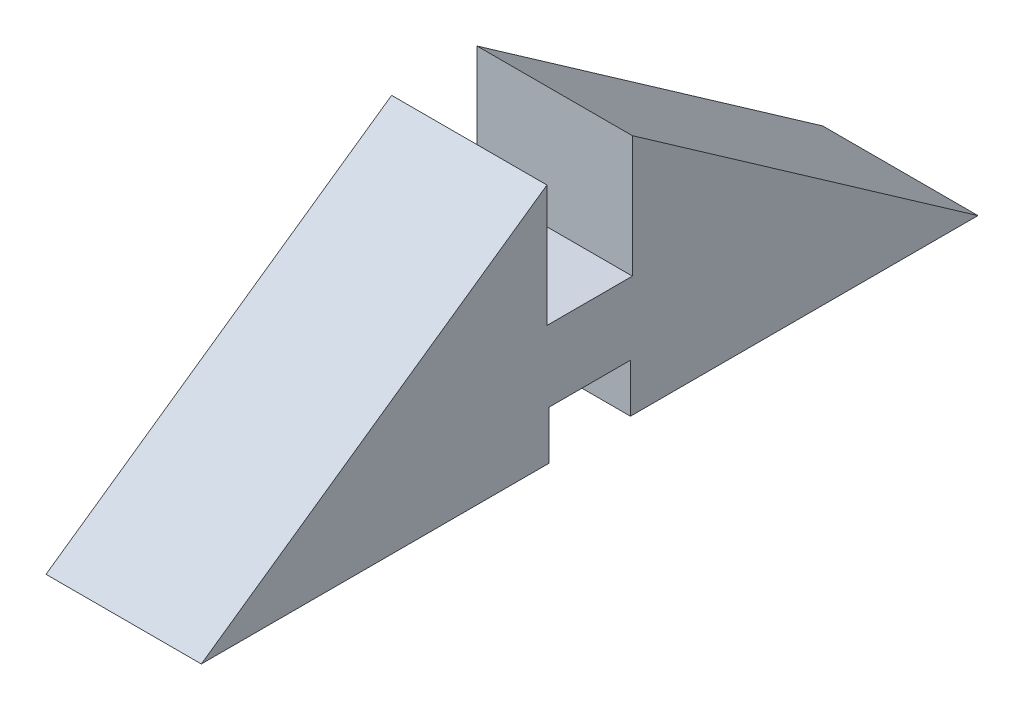
ISO-10303-21;
HEADER;
FILE_DESCRIPTION(('STEP AP214'),'2;1');
FILE_NAME('part.step','',(''),(''),'','','');
FILE_SCHEMA(('AUTOMOTIVE_DESIGN { 1 0 10303 214 1 1 1 1 }'));
ENDSEC;
DATA;
#1=APPLICATION_CONTEXT('core data for automotive mechanical design processes');
#2=APPLICATION_PROTOCOL_DEFINITION('international standard','automotive_design',2000,#1);
#3=PRODUCT_CONTEXT('',#1,'mechanical');
#4=PRODUCT('Part','Part','',(#3));
#5=PRODUCT_RELATED_PRODUCT_CATEGORY('part','',(#4));
#6=PRODUCT_DEFINITION_FORMATION('','',#4);
#7=PRODUCT_DEFINITION_CONTEXT('part definition',#1,'design');
#8=PRODUCT_DEFINITION('design','',#6,#7);
#9=PRODUCT_DEFINITION_SHAPE('','',#8);
#10=(LENGTH_UNIT() NAMED_UNIT(*) SI_UNIT(.MILLI.,.METRE.));
#11=(NAMED_UNIT(*) PLANE_ANGLE_UNIT() SI_UNIT($,.RADIAN.));
#12=(NAMED_UNIT(*) SI_UNIT($,.STERADIAN.) SOLID_ANGLE_UNIT());
#13=UNCERTAINTY_MEASURE_WITH_UNIT(LENGTH_MEASURE(1.E-05),#10,'distance_accuracy_value','');
#14=(GEOMETRIC_REPRESENTATION_CONTEXT(3) GLOBAL_UNCERTAINTY_ASSIGNED_CONTEXT((#13)) GLOBAL_UNIT_ASSIGNED_CONTEXT((#10,
#11,#12)) REPRESENTATION_CONTEXT('',''));
#15=CARTESIAN_POINT('',(0.,0.,0.));
#16=DIRECTION('',(0.,0.,1.));
#17=DIRECTION('',(1.,0.,0.));
#18=AXIS2_PLACEMENT_3D('',#15,#16,#17);
#19=CARTESIAN_POINT('',(-83.9,-55.75,5.25));
#20=DIRECTION('',(0.,-1.,0.));
#21=DIRECTION('',(1.,0.,0.));
#22=AXIS2_PLACEMENT_3D('',#19,#20,#21);
#23=PLANE('',#22);
#24=DIRECTION('',(0.,0.,-1.));
#25=VECTOR('',#24,1.);
#26=CARTESIAN_POINT('',(-73.9,-55.75,5.25));
#27=LINE('',#26,#25);
#28=CARTESIAN_POINT('',(-73.9,-55.75,5.25));
#29=VERTEX_POINT('',#28);
#30=CARTESIAN_POINT('',(-73.9,-55.75,-0.25));
#31=VERTEX_POINT('',#30);
#32=EDGE_CURVE('E141',#29,#31,#27,.T.);
#33=ORIENTED_EDGE('',*,*,#32,.T.);
#34=DIRECTION('',(1.,0.,0.));
#35=VECTOR('',#34,1.);
#36=CARTESIAN_POINT('',(-83.9,-55.75,-0.25));
#37=LINE('',#36,#35);
#38=CARTESIAN_POINT('',(-83.9,-55.75,-0.25));
#39=VERTEX_POINT('',#38);
#40=EDGE_CURVE('E11',#39,#31,#37,.T.);
#41=ORIENTED_EDGE('',*,*,#40,.F.);
#42=DIRECTION('',(0.,0.,-1.));
#43=VECTOR('',#42,1.);
#44=CARTESIAN_POINT('',(-83.9,-55.75,5.25));
#45=LINE('',#44,#43);
#46=CARTESIAN_POINT('',(-83.9,-55.75,5.25));
#47=VERTEX_POINT('',#46);
#48=EDGE_CURVE('E159',#47,#39,#45,.T.);
#49=ORIENTED_EDGE('',*,*,#48,.F.);
#50=DIRECTION('',(1.,0.,0.));
#51=VECTOR('',#50,1.);
#52=CARTESIAN_POINT('',(-83.9,-55.75,5.25));
#53=LINE('',#52,#51);
#54=EDGE_CURVE('E137',#47,#29,#53,.T.);
#55=ORIENTED_EDGE('',*,*,#54,.T.);
#56=EDGE_LOOP('',(#33,#41,#49,#55));
#57=FACE_BOUND('',#56,.T.);
#58=ADVANCED_FACE('F33',(#57),#23,.F.);
#59=CARTESIAN_POINT('',(-83.9,-55.75,-0.25));
#60=DIRECTION('',(0.,0.,-1.));
#61=DIRECTION('',(0.,1.,0.));
#62=AXIS2_PLACEMENT_3D('',#59,#60,#61);
#63=PLANE('',#62);
#64=DIRECTION('',(0.,1.,0.));
#65=VECTOR('',#64,1.);
#66=CARTESIAN_POINT('',(-73.9,-55.75,-0.25));
#67=LINE('',#66,#65);
#68=CARTESIAN_POINT('',(-73.9,-47.9203822748341,-0.25));
#69=VERTEX_POINT('',#68);
#70=EDGE_CURVE('E144',#31,#69,#67,.T.);
#71=ORIENTED_EDGE('',*,*,#70,.T.);
#72=DIRECTION('',(1.,0.,0.));
#73=VECTOR('',#72,1.);
#74=CARTESIAN_POINT('',(-83.9,-47.9203822748341,-0.25));
#75=LINE('',#74,#73);
#76=CARTESIAN_POINT('',(-83.9,-47.9203822748341,-0.25));
#77=VERTEX_POINT('',#76);
#78=EDGE_CURVE('E41',#77,#69,#75,.T.);
#79=ORIENTED_EDGE('',*,*,#78,.F.);
#80=DIRECTION('',(0.,1.,0.));
#81=VECTOR('',#80,1.);
#82=CARTESIAN_POINT('',(-83.9,-55.75,-0.25));
#83=LINE('',#82,#81);
#84=EDGE_CURVE('E98',#39,#77,#83,.T.);
#85=ORIENTED_EDGE('',*,*,#84,.F.);
#86=ORIENTED_EDGE('',*,*,#40,.T.);
#87=EDGE_LOOP('',(#71,#79,#85,#86));
#88=FACE_BOUND('',#87,.T.);
#89=ADVANCED_FACE('F208',(#88),#63,.F.);
#90=CARTESIAN_POINT('',(-83.9,-47.9203822748341,-0.25));
#91=DIRECTION('',(0.,-0.819152044288995,0.573576436351041));
#92=DIRECTION('',(0.,-0.573576436351041,-0.819152044288995));
#93=AXIS2_PLACEMENT_3D('',#90,#91,#92);
#94=PLANE('',#93);
#95=DIRECTION('',(0.,-0.573576436351042,-0.819152044288995));
#96=VECTOR('',#95,1.);
#97=CARTESIAN_POINT('',(-73.9,-47.9203822748341,-0.25));
#98=LINE('',#97,#96);
#99=CARTESIAN_POINT('',(-73.9,-63.5,-22.5));
#100=VERTEX_POINT('',#99);
#101=EDGE_CURVE('E146',#69,#100,#98,.T.);
#102=ORIENTED_EDGE('',*,*,#101,.T.);
#103=DIRECTION('',(1.,0.,0.));
#104=VECTOR('',#103,1.);
#105=CARTESIAN_POINT('',(-83.9,-63.5,-22.5));
#106=LINE('',#105,#104);
#107=CARTESIAN_POINT('',(-83.9,-63.5,-22.5));
#108=VERTEX_POINT('',#107);
#109=EDGE_CURVE('E172',#108,#100,#106,.T.);
#110=ORIENTED_EDGE('',*,*,#109,.F.);
#111=DIRECTION('',(0.,-0.573576436351042,-0.819152044288995));
#112=VECTOR('',#111,1.);
#113=CARTESIAN_POINT('',(-83.9,-47.9203822748341,-0.25));
#114=LINE('',#113,#112);
#115=EDGE_CURVE('E180',#77,#108,#114,.T.);
#116=ORIENTED_EDGE('',*,*,#115,.F.);
#117=ORIENTED_EDGE('',*,*,#78,.T.);
#118=EDGE_LOOP('',(#102,#110,#116,#117));
#119=FACE_BOUND('',#118,.T.);
#120=ADVANCED_FACE('F178',(#119),#94,.F.);
#121=CARTESIAN_POINT('',(-83.9,-63.5,-22.5));
#122=DIRECTION('',(0.,1.,0.));
#123=DIRECTION('',(-1.,0.,0.));
#124=AXIS2_PLACEMENT_3D('',#121,#122,#123);
#125=PLANE('',#124);
#126=DIRECTION('',(0.,0.,1.));
#127=VECTOR('',#126,1.);
#128=CARTESIAN_POINT('',(-73.9,-63.5,-22.5));
#129=LINE('',#128,#127);
#130=CARTESIAN_POINT('',(-73.9,-63.5,-0.125));
#131=VERTEX_POINT('',#130);
#132=EDGE_CURVE('E148',#100,#131,#129,.T.);
#133=ORIENTED_EDGE('',*,*,#132,.T.);
#134=DIRECTION('',(1.,0.,0.));
#135=VECTOR('',#134,1.);
#136=CARTESIAN_POINT('',(-83.9,-63.5,-0.125));
#137=LINE('',#136,#135);
#138=CARTESIAN_POINT('',(-83.9,-63.5,-0.125));
#139=VERTEX_POINT('',#138);
#140=EDGE_CURVE('E169',#139,#131,#137,.T.);
#141=ORIENTED_EDGE('',*,*,#140,.F.);
#142=DIRECTION('',(0.,0.,1.));
#143=VECTOR('',#142,1.);
#144=CARTESIAN_POINT('',(-83.9,-63.5,-22.5));
#145=LINE('',#144,#143);
#146=EDGE_CURVE('E198',#108,#139,#145,.T.);
#147=ORIENTED_EDGE('',*,*,#146,.F.);
#148=ORIENTED_EDGE('',*,*,#109,.T.);
#149=EDGE_LOOP('',(#133,#141,#147,#148));
#150=FACE_BOUND('',#149,.T.);
#151=ADVANCED_FACE('F189',(#150),#125,.F.);
#152=CARTESIAN_POINT('',(-83.9,-60.375,-0.125));
#153=DIRECTION('',(0.,0.,-1.));
#154=DIRECTION('',(0.,1.,0.));
#155=AXIS2_PLACEMENT_3D('',#152,#153,#154);
#156=PLANE('',#155);
#157=DIRECTION('',(0.,1.,0.));
#158=VECTOR('',#157,1.);
#159=CARTESIAN_POINT('',(-73.9,-60.375,-0.125));
#160=LINE('',#159,#158);
#161=CARTESIAN_POINT('',(-73.9,-60.375,-0.125));
#162=VERTEX_POINT('',#161);
#163=EDGE_CURVE('E150',#131,#162,#160,.T.);
#164=ORIENTED_EDGE('',*,*,#163,.T.);
#165=DIRECTION('',(1.,0.,0.));
#166=VECTOR('',#165,1.);
#167=CARTESIAN_POINT('',(-83.9,-60.375,-0.125));
#168=LINE('',#167,#166);
#169=CARTESIAN_POINT('',(-83.9,-60.375,-0.125));
#170=VERTEX_POINT('',#169);
#171=EDGE_CURVE('E166',#170,#162,#168,.T.);
#172=ORIENTED_EDGE('',*,*,#171,.F.);
#173=DIRECTION('',(0.,1.,0.));
#174=VECTOR('',#173,1.);
#175=CARTESIAN_POINT('',(-83.9,-60.375,-0.125));
#176=LINE('',#175,#174);
#177=EDGE_CURVE('E195',#139,#170,#176,.T.);
#178=ORIENTED_EDGE('',*,*,#177,.F.);
#179=ORIENTED_EDGE('',*,*,#140,.T.);
#180=EDGE_LOOP('',(#164,#172,#178,#179));
#181=FACE_BOUND('',#180,.T.);
#182=ADVANCED_FACE('F193',(#181),#156,.F.);
#183=CARTESIAN_POINT('',(-83.9,-60.375,5.125));
#184=DIRECTION('',(0.,1.,0.));
#185=DIRECTION('',(-1.,0.,0.));
#186=AXIS2_PLACEMENT_3D('',#183,#184,#185);
#187=PLANE('',#186);
#188=DIRECTION('',(0.,0.,1.));
#189=VECTOR('',#188,1.);
#190=CARTESIAN_POINT('',(-73.9,-60.375,5.125));
#191=LINE('',#190,#189);
#192=CARTESIAN_POINT('',(-73.9,-60.375,5.125));
#193=VERTEX_POINT('',#192);
#194=EDGE_CURVE('E152',#162,#193,#191,.T.);
#195=ORIENTED_EDGE('',*,*,#194,.T.);
#196=DIRECTION('',(1.,0.,0.));
#197=VECTOR('',#196,1.);
#198=CARTESIAN_POINT('',(-83.9,-60.375,5.125));
#199=LINE('',#198,#197);
#200=CARTESIAN_POINT('',(-83.9,-60.375,5.125));
#201=VERTEX_POINT('',#200);
#202=EDGE_CURVE('E163',#201,#193,#199,.T.);
#203=ORIENTED_EDGE('',*,*,#202,.F.);
#204=DIRECTION('',(0.,0.,1.));
#205=VECTOR('',#204,1.);
#206=CARTESIAN_POINT('',(-83.9,-60.375,5.125));
#207=LINE('',#206,#205);
#208=EDGE_CURVE('E197',#170,#201,#207,.T.);
#209=ORIENTED_EDGE('',*,*,#208,.F.);
#210=ORIENTED_EDGE('',*,*,#171,.T.);
#211=EDGE_LOOP('',(#195,#203,#209,#210));
#212=FACE_BOUND('',#211,.T.);
#213=ADVANCED_FACE('F220',(#212),#187,.F.);
#214=CARTESIAN_POINT('',(-83.9,-63.5,5.125));
#215=DIRECTION('',(0.,0.,1.));
#216=DIRECTION('',(1.,0.,0.));
#217=AXIS2_PLACEMENT_3D('',#214,#215,#216);
#218=PLANE('',#217);
#219=DIRECTION('',(0.,-1.,0.));
#220=VECTOR('',#219,1.);
#221=CARTESIAN_POINT('',(-73.9,-63.5,5.125));
#222=LINE('',#221,#220);
#223=CARTESIAN_POINT('',(-73.9,-63.5,5.125));
#224=VERTEX_POINT('',#223);
#225=EDGE_CURVE('E154',#193,#224,#222,.T.);
#226=ORIENTED_EDGE('',*,*,#225,.T.);
#227=DIRECTION('',(1.,0.,0.));
#228=VECTOR('',#227,1.);
#229=CARTESIAN_POINT('',(-83.9,-63.5,5.125));
#230=LINE('',#229,#228);
#231=CARTESIAN_POINT('',(-83.9,-63.5,5.125));
#232=VERTEX_POINT('',#231);
#233=EDGE_CURVE('E132',#232,#224,#230,.T.);
#234=ORIENTED_EDGE('',*,*,#233,.F.);
#235=DIRECTION('',(0.,-1.,0.));
#236=VECTOR('',#235,1.);
#237=CARTESIAN_POINT('',(-83.9,-63.5,5.125));
#238=LINE('',#237,#236);
#239=EDGE_CURVE('E123',#201,#232,#238,.T.);
#240=ORIENTED_EDGE('',*,*,#239,.F.);
#241=ORIENTED_EDGE('',*,*,#202,.T.);
#242=EDGE_LOOP('',(#226,#234,#240,#241));
#243=FACE_BOUND('',#242,.T.);
#244=ADVANCED_FACE('F223',(#243),#218,.F.);
#245=CARTESIAN_POINT('',(-83.9,-63.5,5.125));
#246=DIRECTION('',(0.,1.,0.));
#247=DIRECTION('',(-1.,0.,0.));
#248=AXIS2_PLACEMENT_3D('',#245,#246,#247);
#249=PLANE('',#248);
#250=DIRECTION('',(0.,0.,1.));
#251=VECTOR('',#250,1.);
#252=CARTESIAN_POINT('',(-73.9,-63.5,5.125));
#253=LINE('',#252,#251);
#254=CARTESIAN_POINT('',(-73.9,-63.5,27.5));
#255=VERTEX_POINT('',#254);
#256=EDGE_CURVE('E131',#224,#255,#253,.T.);
#257=ORIENTED_EDGE('',*,*,#256,.T.);
#258=DIRECTION('',(1.,0.,0.));
#259=VECTOR('',#258,1.);
#260=CARTESIAN_POINT('',(-83.9,-63.5,27.5));
#261=LINE('',#260,#259);
#262=CARTESIAN_POINT('',(-83.9,-63.5,27.5));
#263=VERTEX_POINT('',#262);
#264=EDGE_CURVE('E128',#263,#255,#261,.T.);
#265=ORIENTED_EDGE('',*,*,#264,.F.);
#266=DIRECTION('',(0.,0.,1.));
#267=VECTOR('',#266,1.);
#268=CARTESIAN_POINT('',(-83.9,-63.5,5.125));
#269=LINE('',#268,#267);
#270=EDGE_CURVE('E117',#232,#263,#269,.T.);
#271=ORIENTED_EDGE('',*,*,#270,.F.);
#272=ORIENTED_EDGE('',*,*,#233,.T.);
#273=EDGE_LOOP('',(#257,#265,#271,#272));
#274=FACE_BOUND('',#273,.T.);
#275=ADVANCED_FACE('F129',(#274),#249,.F.);
#276=CARTESIAN_POINT('',(-83.9,-63.5,27.5));
#277=DIRECTION('',(0.,-0.819152044288995,-0.573576436351042));
#278=DIRECTION('',(0.,0.573576436351042,-0.819152044288995));
#279=AXIS2_PLACEMENT_3D('',#276,#277,#278);
#280=PLANE('',#279);
#281=DIRECTION('',(0.,0.573576436351042,-0.819152044288995));
#282=VECTOR('',#281,1.);
#283=CARTESIAN_POINT('',(-73.9,-63.5,27.5));
#284=LINE('',#283,#282);
#285=CARTESIAN_POINT('',(-73.9,-47.9203822748341,5.25));
#286=VERTEX_POINT('',#285);
#287=EDGE_CURVE('E84',#255,#286,#284,.T.);
#288=ORIENTED_EDGE('',*,*,#287,.T.);
#289=DIRECTION('',(1.,0.,0.));
#290=VECTOR('',#289,1.);
#291=CARTESIAN_POINT('',(-83.9,-47.9203822748341,5.25));
#292=LINE('',#291,#290);
#293=CARTESIAN_POINT('',(-83.9,-47.9203822748341,5.25));
#294=VERTEX_POINT('',#293);
#295=EDGE_CURVE('E133',#294,#286,#292,.T.);
#296=ORIENTED_EDGE('',*,*,#295,.F.);
#297=DIRECTION('',(0.,0.573576436351042,-0.819152044288995));
#298=VECTOR('',#297,1.);
#299=CARTESIAN_POINT('',(-83.9,-63.5,27.5));
#300=LINE('',#299,#298);
#301=EDGE_CURVE('E121',#263,#294,#300,.T.);
#302=ORIENTED_EDGE('',*,*,#301,.F.);
#303=ORIENTED_EDGE('',*,*,#264,.T.);
#304=EDGE_LOOP('',(#288,#296,#302,#303));
#305=FACE_BOUND('',#304,.T.);
#306=ADVANCED_FACE('F135',(#305),#280,.F.);
#307=CARTESIAN_POINT('',(-83.9,-47.9203822748341,5.25));
#308=DIRECTION('',(0.,0.,1.));
#309=DIRECTION('',(1.,0.,0.));
#310=AXIS2_PLACEMENT_3D('',#307,#308,#309);
#311=PLANE('',#310);
#312=DIRECTION('',(0.,-1.,0.));
#313=VECTOR('',#312,1.);
#314=CARTESIAN_POINT('',(-73.9,-47.9203822748341,5.25));
#315=LINE('',#314,#313);
#316=EDGE_CURVE('E90',#286,#29,#315,.T.);
#317=ORIENTED_EDGE('',*,*,#316,.T.);
#318=ORIENTED_EDGE('',*,*,#54,.F.);
#319=DIRECTION('',(0.,-1.,0.));
#320=VECTOR('',#319,1.);
#321=CARTESIAN_POINT('',(-83.9,-47.9203822748341,5.25));
#322=LINE('',#321,#320);
#323=EDGE_CURVE('E49',#294,#47,#322,.T.);
#324=ORIENTED_EDGE('',*,*,#323,.F.);
#325=ORIENTED_EDGE('',*,*,#295,.T.);
#326=EDGE_LOOP('',(#317,#318,#324,#325));
#327=FACE_BOUND('',#326,.T.);
#328=ADVANCED_FACE('F232',(#327),#311,.F.);
#329=CARTESIAN_POINT('',(-83.9000000000001,-1.48333006351288E-13,0.));
#330=DIRECTION('',(1.,0.,0.));
#331=DIRECTION('',(0.,1.,0.));
#332=AXIS2_PLACEMENT_3D('',#329,#330,#331);
#333=PLANE('',#332);
#334=ORIENTED_EDGE('',*,*,#48,.T.);
#335=ORIENTED_EDGE('',*,*,#84,.T.);
#336=ORIENTED_EDGE('',*,*,#115,.T.);
#337=ORIENTED_EDGE('',*,*,#146,.T.);
#338=ORIENTED_EDGE('',*,*,#177,.T.);
#339=ORIENTED_EDGE('',*,*,#208,.T.);
#340=ORIENTED_EDGE('',*,*,#239,.T.);
#341=ORIENTED_EDGE('',*,*,#270,.T.);
#342=ORIENTED_EDGE('',*,*,#301,.T.);
#343=ORIENTED_EDGE('',*,*,#323,.T.);
#344=EDGE_LOOP('',(#334,#335,#336,#337,#338,#339,#340,#341,#342,#343));
#345=FACE_BOUND('',#344,.T.);
#346=ADVANCED_FACE('F119',(#345),#333,.F.);
#347=CARTESIAN_POINT('',(-73.9000000000001,-1.3098577159152E-13,0.));
#348=DIRECTION('',(1.,0.,0.));
#349=DIRECTION('',(0.,1.,0.));
#350=AXIS2_PLACEMENT_3D('',#347,#348,#349);
#351=PLANE('',#350);
#352=ORIENTED_EDGE('',*,*,#32,.F.);
#353=ORIENTED_EDGE('',*,*,#316,.F.);
#354=ORIENTED_EDGE('',*,*,#287,.F.);
#355=ORIENTED_EDGE('',*,*,#256,.F.);
#356=ORIENTED_EDGE('',*,*,#225,.F.);
#357=ORIENTED_EDGE('',*,*,#194,.F.);
#358=ORIENTED_EDGE('',*,*,#163,.F.);
#359=ORIENTED_EDGE('',*,*,#132,.F.);
#360=ORIENTED_EDGE('',*,*,#101,.F.);
#361=ORIENTED_EDGE('',*,*,#70,.F.);
#362=EDGE_LOOP('',(#352,#353,#354,#355,#356,#357,#358,#359,#360,#361));
#363=FACE_BOUND('',#362,.T.);
#364=ADVANCED_FACE('F184',(#363),#351,.T.);
#365=CLOSED_SHELL('',(#58,#89,#120,#151,#182,#213,#244,#275,#306,#328,#346,#364));
#366=MANIFOLD_SOLID_BREP('B2',#365);
#367=ADVANCED_BREP_SHAPE_REPRESENTATION('',(#18,#366),#14);
#368=SHAPE_DEFINITION_REPRESENTATION(#9,#367);
ENDSEC;
END-ISO-10303-21;
